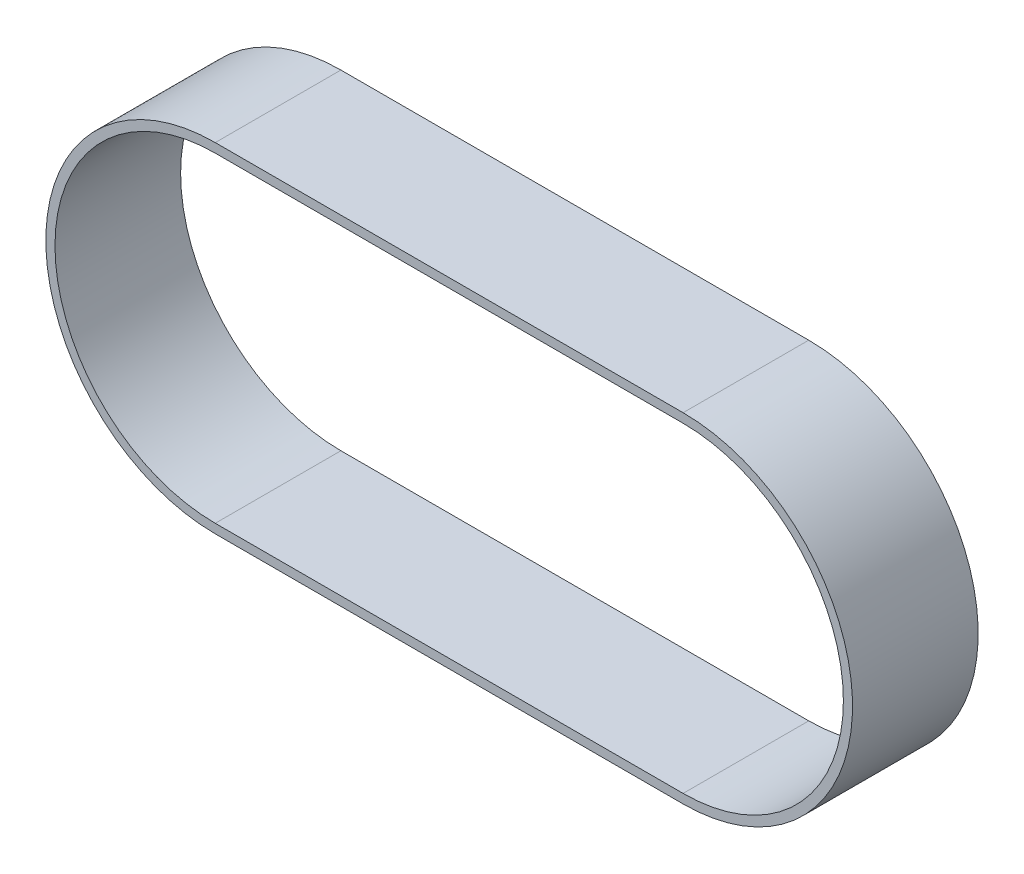
ISO-10303-21;
HEADER;
FILE_DESCRIPTION(('STEP AP214'),'2;1');
FILE_NAME('part.step','',(''),(''),'','','');
FILE_SCHEMA(('AUTOMOTIVE_DESIGN { 1 0 10303 214 1 1 1 1 }'));
ENDSEC;
DATA;
#1=APPLICATION_CONTEXT('core data for automotive mechanical design processes');
#2=APPLICATION_PROTOCOL_DEFINITION('international standard','automotive_design',2000,#1);
#3=PRODUCT_CONTEXT('',#1,'mechanical');
#4=PRODUCT('Part','Part','',(#3));
#5=PRODUCT_RELATED_PRODUCT_CATEGORY('part','',(#4));
#6=PRODUCT_DEFINITION_FORMATION('','',#4);
#7=PRODUCT_DEFINITION_CONTEXT('part definition',#1,'design');
#8=PRODUCT_DEFINITION('design','',#6,#7);
#9=PRODUCT_DEFINITION_SHAPE('','',#8);
#10=(LENGTH_UNIT() NAMED_UNIT(*) SI_UNIT(.MILLI.,.METRE.));
#11=(NAMED_UNIT(*) PLANE_ANGLE_UNIT() SI_UNIT($,.RADIAN.));
#12=(NAMED_UNIT(*) SI_UNIT($,.STERADIAN.) SOLID_ANGLE_UNIT());
#13=UNCERTAINTY_MEASURE_WITH_UNIT(LENGTH_MEASURE(1.E-05),#10,'distance_accuracy_value','');
#14=(GEOMETRIC_REPRESENTATION_CONTEXT(3) GLOBAL_UNCERTAINTY_ASSIGNED_CONTEXT((#13)) GLOBAL_UNIT_ASSIGNED_CONTEXT((#10,
#11,#12)) REPRESENTATION_CONTEXT('',''));
#15=CARTESIAN_POINT('',(0.,0.,0.));
#16=DIRECTION('',(0.,0.,1.));
#17=DIRECTION('',(1.,0.,0.));
#18=AXIS2_PLACEMENT_3D('',#15,#16,#17);
#19=CARTESIAN_POINT('',(-25.6,1.,0.));
#20=DIRECTION('',(0.,0.,-1.));
#21=DIRECTION('',(-1.,0.,0.));
#22=AXIS2_PLACEMENT_3D('',#19,#20,#21);
#23=PLANE('',#22);
#24=CARTESIAN_POINT('',(25.6,18.54,0.));
#25=DIRECTION('',(0.,0.,1.));
#26=DIRECTION('',(1.,0.,0.));
#27=AXIS2_PLACEMENT_3D('',#24,#25,#26);
#28=CIRCLE('',#27,18.54);
#29=CARTESIAN_POINT('',(25.6,37.08,0.));
#30=VERTEX_POINT('',#29);
#31=CARTESIAN_POINT('',(25.6,0.,0.));
#32=VERTEX_POINT('',#31);
#33=EDGE_CURVE('E103',#30,#32,#28,.F.);
#34=ORIENTED_EDGE('',*,*,#33,.F.);
#35=DIRECTION('',(-1.,0.,0.));
#36=VECTOR('',#35,1.);
#37=CARTESIAN_POINT('',(39.3863156789622,37.08,0.));
#38=LINE('',#37,#36);
#39=CARTESIAN_POINT('',(-25.6,37.08,0.));
#40=VERTEX_POINT('',#39);
#41=EDGE_CURVE('E153',#30,#40,#38,.T.);
#42=ORIENTED_EDGE('',*,*,#41,.T.);
#43=CARTESIAN_POINT('',(-25.6,18.54,0.));
#44=DIRECTION('',(0.,0.,1.));
#45=DIRECTION('',(1.,0.,0.));
#46=AXIS2_PLACEMENT_3D('',#43,#44,#45);
#47=CIRCLE('',#46,18.54);
#48=CARTESIAN_POINT('',(-25.6,0.,0.));
#49=VERTEX_POINT('',#48);
#50=EDGE_CURVE('E104',#40,#49,#47,.T.);
#51=ORIENTED_EDGE('',*,*,#50,.T.);
#52=DIRECTION('',(1.,0.,0.));
#53=VECTOR('',#52,1.);
#54=CARTESIAN_POINT('',(-25.6,0.,0.));
#55=LINE('',#54,#53);
#56=EDGE_CURVE('E63',#49,#32,#55,.T.);
#57=ORIENTED_EDGE('',*,*,#56,.T.);
#58=EDGE_LOOP('',(#34,#42,#51,#57));
#59=FACE_BOUND('',#58,.T.);
#60=DIRECTION('',(-1.,0.,0.));
#61=VECTOR('',#60,1.);
#62=CARTESIAN_POINT('',(39.3863156789622,36.08,0.));
#63=LINE('',#62,#61);
#64=CARTESIAN_POINT('',(25.6,36.08,0.));
#65=VERTEX_POINT('',#64);
#66=CARTESIAN_POINT('',(-25.6,36.08,0.));
#67=VERTEX_POINT('',#66);
#68=EDGE_CURVE('E102',#65,#67,#63,.T.);
#69=ORIENTED_EDGE('',*,*,#68,.F.);
#70=CARTESIAN_POINT('',(25.6,18.54,0.));
#71=DIRECTION('',(0.,0.,1.));
#72=DIRECTION('',(1.,0.,0.));
#73=AXIS2_PLACEMENT_3D('',#70,#71,#72);
#74=CIRCLE('',#73,17.54);
#75=CARTESIAN_POINT('',(25.6,1.,0.));
#76=VERTEX_POINT('',#75);
#77=EDGE_CURVE('E96',#65,#76,#74,.F.);
#78=ORIENTED_EDGE('',*,*,#77,.T.);
#79=DIRECTION('',(1.,0.,0.));
#80=VECTOR('',#79,1.);
#81=CARTESIAN_POINT('',(-25.6,1.,0.));
#82=LINE('',#81,#80);
#83=CARTESIAN_POINT('',(-25.6,1.,0.));
#84=VERTEX_POINT('',#83);
#85=EDGE_CURVE('E80',#84,#76,#82,.T.);
#86=ORIENTED_EDGE('',*,*,#85,.F.);
#87=CARTESIAN_POINT('',(-25.6,18.54,0.));
#88=DIRECTION('',(0.,0.,1.));
#89=DIRECTION('',(1.,0.,0.));
#90=AXIS2_PLACEMENT_3D('',#87,#88,#89);
#91=CIRCLE('',#90,17.54);
#92=EDGE_CURVE('E109',#67,#84,#91,.T.);
#93=ORIENTED_EDGE('',*,*,#92,.F.);
#94=EDGE_LOOP('',(#69,#78,#86,#93));
#95=FACE_BOUND('',#94,.T.);
#96=ADVANCED_FACE('F35',(#59,#95),#23,.F.);
#97=CARTESIAN_POINT('',(-25.6,1.,-13.75));
#98=DIRECTION('',(0.,0.,1.));
#99=DIRECTION('',(1.,0.,0.));
#100=AXIS2_PLACEMENT_3D('',#97,#98,#99);
#101=PLANE('',#100);
#102=CARTESIAN_POINT('',(25.6,18.54,-13.75));
#103=DIRECTION('',(0.,0.,1.));
#104=DIRECTION('',(1.,0.,0.));
#105=AXIS2_PLACEMENT_3D('',#102,#103,#104);
#106=CIRCLE('',#105,17.54);
#107=CARTESIAN_POINT('',(25.6,1.,-13.75));
#108=VERTEX_POINT('',#107);
#109=CARTESIAN_POINT('',(25.6,36.08,-13.75));
#110=VERTEX_POINT('',#109);
#111=EDGE_CURVE('E98',#108,#110,#106,.T.);
#112=ORIENTED_EDGE('',*,*,#111,.T.);
#113=DIRECTION('',(-1.,0.,0.));
#114=VECTOR('',#113,1.);
#115=CARTESIAN_POINT('',(39.3863156789622,36.08,-13.75));
#116=LINE('',#115,#114);
#117=CARTESIAN_POINT('',(-25.6,36.08,-13.75));
#118=VERTEX_POINT('',#117);
#119=EDGE_CURVE('E149',#110,#118,#116,.T.);
#120=ORIENTED_EDGE('',*,*,#119,.T.);
#121=CARTESIAN_POINT('',(-25.6,18.54,-13.75));
#122=DIRECTION('',(0.,0.,1.));
#123=DIRECTION('',(1.,0.,0.));
#124=AXIS2_PLACEMENT_3D('',#121,#122,#123);
#125=CIRCLE('',#124,17.54);
#126=CARTESIAN_POINT('',(-25.6,1.,-13.75));
#127=VERTEX_POINT('',#126);
#128=EDGE_CURVE('E144',#127,#118,#125,.F.);
#129=ORIENTED_EDGE('',*,*,#128,.F.);
#130=DIRECTION('',(-1.,0.,0.));
#131=VECTOR('',#130,1.);
#132=CARTESIAN_POINT('',(-25.6,1.,-13.75));
#133=LINE('',#132,#131);
#134=EDGE_CURVE('E11',#108,#127,#133,.T.);
#135=ORIENTED_EDGE('',*,*,#134,.F.);
#136=EDGE_LOOP('',(#112,#120,#129,#135));
#137=FACE_BOUND('',#136,.T.);
#138=DIRECTION('',(-1.,0.,0.));
#139=VECTOR('',#138,1.);
#140=CARTESIAN_POINT('',(-25.6,0.,-13.75));
#141=LINE('',#140,#139);
#142=CARTESIAN_POINT('',(25.6,0.,-13.75));
#143=VERTEX_POINT('',#142);
#144=CARTESIAN_POINT('',(-25.6,0.,-13.75));
#145=VERTEX_POINT('',#144);
#146=EDGE_CURVE('E38',#143,#145,#141,.T.);
#147=ORIENTED_EDGE('',*,*,#146,.T.);
#148=CARTESIAN_POINT('',(-25.6,18.54,-13.75));
#149=DIRECTION('',(0.,0.,1.));
#150=DIRECTION('',(1.,0.,0.));
#151=AXIS2_PLACEMENT_3D('',#148,#149,#150);
#152=CIRCLE('',#151,18.54);
#153=CARTESIAN_POINT('',(-25.6,37.08,-13.75));
#154=VERTEX_POINT('',#153);
#155=EDGE_CURVE('E134',#145,#154,#152,.F.);
#156=ORIENTED_EDGE('',*,*,#155,.T.);
#157=DIRECTION('',(-1.,0.,0.));
#158=VECTOR('',#157,1.);
#159=CARTESIAN_POINT('',(39.3863156789622,37.08,-13.75));
#160=LINE('',#159,#158);
#161=CARTESIAN_POINT('',(25.6,37.08,-13.75));
#162=VERTEX_POINT('',#161);
#163=EDGE_CURVE('E145',#162,#154,#160,.T.);
#164=ORIENTED_EDGE('',*,*,#163,.F.);
#165=CARTESIAN_POINT('',(25.6,18.54,-13.75));
#166=DIRECTION('',(0.,0.,1.));
#167=DIRECTION('',(1.,0.,0.));
#168=AXIS2_PLACEMENT_3D('',#165,#166,#167);
#169=CIRCLE('',#168,18.54);
#170=EDGE_CURVE('E112',#143,#162,#169,.T.);
#171=ORIENTED_EDGE('',*,*,#170,.F.);
#172=EDGE_LOOP('',(#147,#156,#164,#171));
#173=FACE_BOUND('',#172,.T.);
#174=ADVANCED_FACE('F130',(#137,#173),#101,.F.);
#175=CARTESIAN_POINT('',(0.,1.,0.));
#176=DIRECTION('',(0.,1.,0.));
#177=DIRECTION('',(0.,0.,1.));
#178=AXIS2_PLACEMENT_3D('',#175,#176,#177);
#179=PLANE('',#178);
#180=DIRECTION('',(0.,0.,1.));
#181=VECTOR('',#180,1.);
#182=CARTESIAN_POINT('',(-25.6,1.,-13.75));
#183=LINE('',#182,#181);
#184=EDGE_CURVE('E84',#127,#84,#183,.T.);
#185=ORIENTED_EDGE('',*,*,#184,.T.);
#186=ORIENTED_EDGE('',*,*,#85,.T.);
#187=DIRECTION('',(0.,0.,-1.));
#188=VECTOR('',#187,1.);
#189=CARTESIAN_POINT('',(25.6,1.,-13.75));
#190=LINE('',#189,#188);
#191=EDGE_CURVE('E44',#76,#108,#190,.T.);
#192=ORIENTED_EDGE('',*,*,#191,.T.);
#193=ORIENTED_EDGE('',*,*,#134,.T.);
#194=EDGE_LOOP('',(#185,#186,#192,#193));
#195=FACE_BOUND('',#194,.T.);
#196=ADVANCED_FACE('F82',(#195),#179,.T.);
#197=CARTESIAN_POINT('',(0.,0.,0.));
#198=DIRECTION('',(0.,1.,0.));
#199=DIRECTION('',(0.,0.,1.));
#200=AXIS2_PLACEMENT_3D('',#197,#198,#199);
#201=PLANE('',#200);
#202=DIRECTION('',(0.,0.,1.));
#203=VECTOR('',#202,1.);
#204=CARTESIAN_POINT('',(-25.6,0.,-13.75));
#205=LINE('',#204,#203);
#206=EDGE_CURVE('E120',#145,#49,#205,.T.);
#207=ORIENTED_EDGE('',*,*,#206,.F.);
#208=ORIENTED_EDGE('',*,*,#146,.F.);
#209=DIRECTION('',(0.,0.,-1.));
#210=VECTOR('',#209,1.);
#211=CARTESIAN_POINT('',(25.6,0.,-13.75));
#212=LINE('',#211,#210);
#213=EDGE_CURVE('E124',#32,#143,#212,.T.);
#214=ORIENTED_EDGE('',*,*,#213,.F.);
#215=ORIENTED_EDGE('',*,*,#56,.F.);
#216=EDGE_LOOP('',(#207,#208,#214,#215));
#217=FACE_BOUND('',#216,.T.);
#218=ADVANCED_FACE('F136',(#217),#201,.F.);
#219=CARTESIAN_POINT('',(25.6,18.54,-55.2067003028461));
#220=DIRECTION('',(0.,0.,1.));
#221=DIRECTION('',(1.,0.,0.));
#222=AXIS2_PLACEMENT_3D('',#219,#220,#221);
#223=CYLINDRICAL_SURFACE('',#222,18.54);
#224=ORIENTED_EDGE('',*,*,#213,.T.);
#225=ORIENTED_EDGE('',*,*,#170,.T.);
#226=DIRECTION('',(0.,0.,1.));
#227=VECTOR('',#226,1.);
#228=CARTESIAN_POINT('',(25.6,37.08,-55.2067003028461));
#229=LINE('',#228,#227);
#230=EDGE_CURVE('E115',#162,#30,#229,.T.);
#231=ORIENTED_EDGE('',*,*,#230,.T.);
#232=ORIENTED_EDGE('',*,*,#33,.T.);
#233=EDGE_LOOP('',(#224,#225,#231,#232));
#234=FACE_BOUND('',#233,.T.);
#235=ADVANCED_FACE('F191',(#234),#223,.T.);
#236=CARTESIAN_POINT('',(25.6,18.54,-55.2067003028461));
#237=DIRECTION('',(0.,0.,1.));
#238=DIRECTION('',(1.,0.,0.));
#239=AXIS2_PLACEMENT_3D('',#236,#237,#238);
#240=CYLINDRICAL_SURFACE('',#239,17.54);
#241=ORIENTED_EDGE('',*,*,#111,.F.);
#242=ORIENTED_EDGE('',*,*,#191,.F.);
#243=ORIENTED_EDGE('',*,*,#77,.F.);
#244=DIRECTION('',(0.,0.,1.));
#245=VECTOR('',#244,1.);
#246=CARTESIAN_POINT('',(25.6,36.08,-55.2067003028461));
#247=LINE('',#246,#245);
#248=EDGE_CURVE('E107',#110,#65,#247,.T.);
#249=ORIENTED_EDGE('',*,*,#248,.F.);
#250=EDGE_LOOP('',(#241,#242,#243,#249));
#251=FACE_BOUND('',#250,.T.);
#252=ADVANCED_FACE('F93',(#251),#240,.F.);
#253=CARTESIAN_POINT('',(-25.6,18.54,-55.2067003028461));
#254=DIRECTION('',(0.,0.,1.));
#255=DIRECTION('',(1.,0.,0.));
#256=AXIS2_PLACEMENT_3D('',#253,#254,#255);
#257=CYLINDRICAL_SURFACE('',#256,17.54);
#258=ORIENTED_EDGE('',*,*,#184,.F.);
#259=ORIENTED_EDGE('',*,*,#128,.T.);
#260=DIRECTION('',(0.,0.,1.));
#261=VECTOR('',#260,1.);
#262=CARTESIAN_POINT('',(-25.6,36.08,-55.2067003028461));
#263=LINE('',#262,#261);
#264=EDGE_CURVE('E148',#118,#67,#263,.T.);
#265=ORIENTED_EDGE('',*,*,#264,.T.);
#266=ORIENTED_EDGE('',*,*,#92,.T.);
#267=EDGE_LOOP('',(#258,#259,#265,#266));
#268=FACE_BOUND('',#267,.T.);
#269=ADVANCED_FACE('F158',(#268),#257,.F.);
#270=CARTESIAN_POINT('',(-25.6,18.54,-55.2067003028461));
#271=DIRECTION('',(0.,0.,1.));
#272=DIRECTION('',(1.,0.,0.));
#273=AXIS2_PLACEMENT_3D('',#270,#271,#272);
#274=CYLINDRICAL_SURFACE('',#273,18.54);
#275=ORIENTED_EDGE('',*,*,#155,.F.);
#276=ORIENTED_EDGE('',*,*,#206,.T.);
#277=ORIENTED_EDGE('',*,*,#50,.F.);
#278=DIRECTION('',(0.,0.,1.));
#279=VECTOR('',#278,1.);
#280=CARTESIAN_POINT('',(-25.6,37.08,-55.2067003028461));
#281=LINE('',#280,#279);
#282=EDGE_CURVE('E142',#154,#40,#281,.T.);
#283=ORIENTED_EDGE('',*,*,#282,.F.);
#284=EDGE_LOOP('',(#275,#276,#277,#283));
#285=FACE_BOUND('',#284,.T.);
#286=ADVANCED_FACE('F140',(#285),#274,.T.);
#287=CARTESIAN_POINT('',(39.3863156789622,36.08,0.));
#288=DIRECTION('',(0.,1.,0.));
#289=DIRECTION('',(0.,0.,1.));
#290=AXIS2_PLACEMENT_3D('',#287,#288,#289);
#291=PLANE('',#290);
#292=ORIENTED_EDGE('',*,*,#248,.T.);
#293=ORIENTED_EDGE('',*,*,#68,.T.);
#294=ORIENTED_EDGE('',*,*,#264,.F.);
#295=ORIENTED_EDGE('',*,*,#119,.F.);
#296=EDGE_LOOP('',(#292,#293,#294,#295));
#297=FACE_BOUND('',#296,.T.);
#298=ADVANCED_FACE('F163',(#297),#291,.F.);
#299=CARTESIAN_POINT('',(39.3863156789622,37.08,0.));
#300=DIRECTION('',(0.,-1.,0.));
#301=DIRECTION('',(0.,0.,-1.));
#302=AXIS2_PLACEMENT_3D('',#299,#300,#301);
#303=PLANE('',#302);
#304=ORIENTED_EDGE('',*,*,#230,.F.);
#305=ORIENTED_EDGE('',*,*,#163,.T.);
#306=ORIENTED_EDGE('',*,*,#282,.T.);
#307=ORIENTED_EDGE('',*,*,#41,.F.);
#308=EDGE_LOOP('',(#304,#305,#306,#307));
#309=FACE_BOUND('',#308,.T.);
#310=ADVANCED_FACE('F176',(#309),#303,.F.);
#311=CLOSED_SHELL('',(#96,#174,#196,#218,#235,#252,#269,#286,#298,#310));
#312=MANIFOLD_SOLID_BREP('B2',#311);
#313=ADVANCED_BREP_SHAPE_REPRESENTATION('',(#18,#312),#14);
#314=SHAPE_DEFINITION_REPRESENTATION(#9,#313);
ENDSEC;
END-ISO-10303-21;
